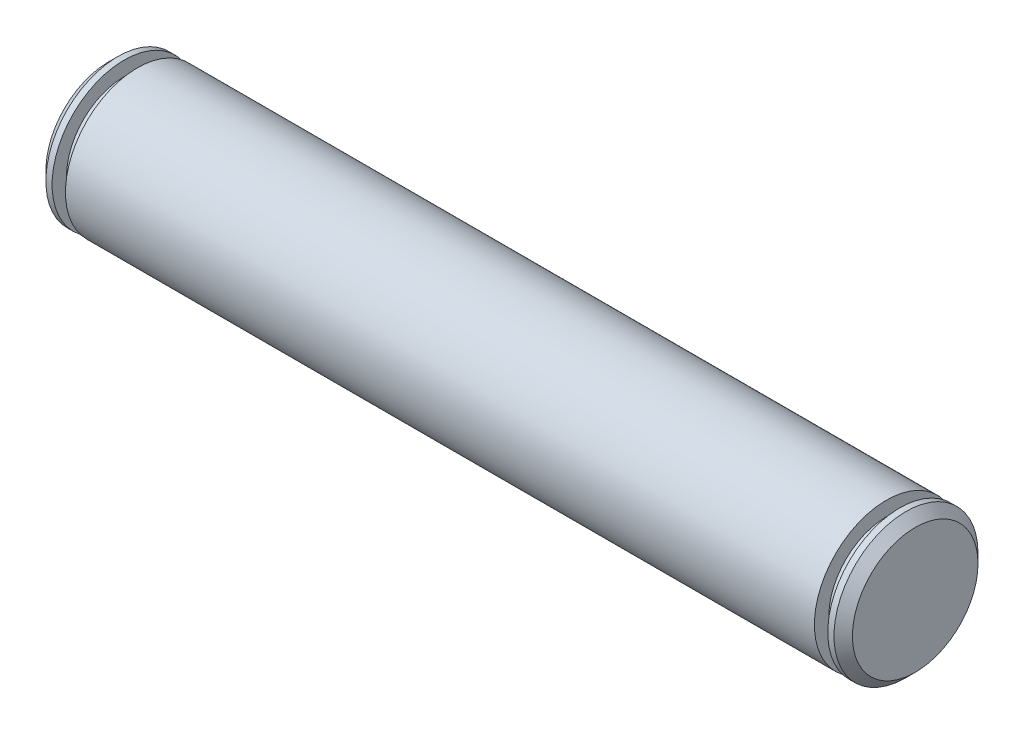
ISO-10303-21;
HEADER;
FILE_DESCRIPTION(('STEP AP214'),'2;1');
FILE_NAME('part.step','',(''),(''),'','','');
FILE_SCHEMA(('AUTOMOTIVE_DESIGN { 1 0 10303 214 1 1 1 1 }'));
ENDSEC;
DATA;
#1=APPLICATION_CONTEXT('core data for automotive mechanical design processes');
#2=APPLICATION_PROTOCOL_DEFINITION('international standard','automotive_design',2000,#1);
#3=PRODUCT_CONTEXT('',#1,'mechanical');
#4=PRODUCT('Part','Part','',(#3));
#5=PRODUCT_RELATED_PRODUCT_CATEGORY('part','',(#4));
#6=PRODUCT_DEFINITION_FORMATION('','',#4);
#7=PRODUCT_DEFINITION_CONTEXT('part definition',#1,'design');
#8=PRODUCT_DEFINITION('design','',#6,#7);
#9=PRODUCT_DEFINITION_SHAPE('','',#8);
#10=(LENGTH_UNIT() NAMED_UNIT(*) SI_UNIT(.MILLI.,.METRE.));
#11=(NAMED_UNIT(*) PLANE_ANGLE_UNIT() SI_UNIT($,.RADIAN.));
#12=(NAMED_UNIT(*) SI_UNIT($,.STERADIAN.) SOLID_ANGLE_UNIT());
#13=UNCERTAINTY_MEASURE_WITH_UNIT(LENGTH_MEASURE(1.E-05),#10,'distance_accuracy_value','');
#14=(GEOMETRIC_REPRESENTATION_CONTEXT(3) GLOBAL_UNCERTAINTY_ASSIGNED_CONTEXT((#13)) GLOBAL_UNIT_ASSIGNED_CONTEXT((#10,
#11,#12)) REPRESENTATION_CONTEXT('',''));
#15=CARTESIAN_POINT('',(0.,0.,0.));
#16=DIRECTION('',(0.,0.,1.));
#17=DIRECTION('',(1.,0.,0.));
#18=AXIS2_PLACEMENT_3D('',#15,#16,#17);
#19=CARTESIAN_POINT('',(22.225,0.,0.));
#20=DIRECTION('',(-1.,0.,0.));
#21=DIRECTION('',(0.,0.,1.));
#22=AXIS2_PLACEMENT_3D('',#19,#20,#21);
#23=CYLINDRICAL_SURFACE('',#22,3.96875);
#24=CARTESIAN_POINT('',(20.6375,0.,0.));
#25=DIRECTION('',(1.,0.,0.));
#26=DIRECTION('',(0.,0.,-1.));
#27=AXIS2_PLACEMENT_3D('',#24,#25,#26);
#28=CIRCLE('',#27,3.96875);
#29=CARTESIAN_POINT('',(20.6375,0.,-3.96875));
#30=VERTEX_POINT('',#29);
#31=EDGE_CURVE('E52',#30,#30,#28,.T.);
#32=ORIENTED_EDGE('',*,*,#31,.F.);
#33=EDGE_LOOP('',(#32));
#34=FACE_BOUND('',#33,.T.);
#35=CARTESIAN_POINT('',(-20.6375,0.,0.));
#36=DIRECTION('',(1.,0.,0.));
#37=DIRECTION('',(0.,0.,-1.));
#38=AXIS2_PLACEMENT_3D('',#35,#36,#37);
#39=CIRCLE('',#38,3.96875);
#40=CARTESIAN_POINT('',(-20.6375,0.,-3.96875));
#41=VERTEX_POINT('',#40);
#42=EDGE_CURVE('E64',#41,#41,#39,.T.);
#43=ORIENTED_EDGE('',*,*,#42,.T.);
#44=EDGE_LOOP('',(#43));
#45=FACE_BOUND('',#44,.T.);
#46=ADVANCED_FACE('F31',(#34,#45),#23,.T.);
#47=CARTESIAN_POINT('',(21.3741,0.,0.));
#48=DIRECTION('',(1.,0.,0.));
#49=DIRECTION('',(0.,0.,-1.));
#50=AXIS2_PLACEMENT_3D('',#47,#48,#49);
#51=CIRCLE('',#50,3.96875);
#52=CARTESIAN_POINT('',(21.3741,0.,-3.96875));
#53=VERTEX_POINT('',#52);
#54=EDGE_CURVE('E51',#53,#53,#51,.T.);
#55=ORIENTED_EDGE('',*,*,#54,.T.);
#56=EDGE_LOOP('',(#55));
#57=FACE_BOUND('',#56,.T.);
#58=CARTESIAN_POINT('',(21.717,0.,0.));
#59=DIRECTION('',(1.,0.,0.));
#60=DIRECTION('',(0.,0.,-1.));
#61=AXIS2_PLACEMENT_3D('',#58,#59,#60);
#62=CIRCLE('',#61,3.96875);
#63=CARTESIAN_POINT('',(21.717,0.,-3.96875));
#64=VERTEX_POINT('',#63);
#65=EDGE_CURVE('E46',#64,#64,#62,.F.);
#66=ORIENTED_EDGE('',*,*,#65,.T.);
#67=EDGE_LOOP('',(#66));
#68=FACE_BOUND('',#67,.T.);
#69=ADVANCED_FACE('F92',(#57,#68),#23,.T.);
#70=CARTESIAN_POINT('',(22.225,0.,0.));
#71=DIRECTION('',(1.,0.,0.));
#72=DIRECTION('',(0.,0.,-1.));
#73=AXIS2_PLACEMENT_3D('',#70,#71,#72);
#74=PLANE('',#73);
#75=CARTESIAN_POINT('',(22.225,0.,0.));
#76=DIRECTION('',(1.,0.,0.));
#77=DIRECTION('',(0.,0.,-1.));
#78=AXIS2_PLACEMENT_3D('',#75,#76,#77);
#79=CIRCLE('',#78,3.46075);
#80=CARTESIAN_POINT('',(22.225,0.,-3.46075));
#81=VERTEX_POINT('',#80);
#82=EDGE_CURVE('E10',#81,#81,#79,.T.);
#83=ORIENTED_EDGE('',*,*,#82,.T.);
#84=EDGE_LOOP('',(#83));
#85=FACE_BOUND('',#84,.T.);
#86=ADVANCED_FACE('F107',(#85),#74,.T.);
#87=CARTESIAN_POINT('',(22.225,0.,0.));
#88=DIRECTION('',(-1.,0.,0.));
#89=DIRECTION('',(0.,0.,1.));
#90=AXIS2_PLACEMENT_3D('',#87,#88,#89);
#91=CONICAL_SURFACE('',#90,3.46075,0.785398163397448);
#92=ORIENTED_EDGE('',*,*,#65,.F.);
#93=EDGE_LOOP('',(#92));
#94=FACE_BOUND('',#93,.T.);
#95=ORIENTED_EDGE('',*,*,#82,.F.);
#96=EDGE_LOOP('',(#95));
#97=FACE_BOUND('',#96,.T.);
#98=ADVANCED_FACE('F33',(#94,#97),#91,.T.);
#99=CARTESIAN_POINT('',(21.3741,0.,0.));
#100=DIRECTION('',(1.,0.,0.));
#101=DIRECTION('',(0.,0.,-1.));
#102=AXIS2_PLACEMENT_3D('',#99,#100,#101);
#103=PLANE('',#102);
#104=ORIENTED_EDGE('',*,*,#54,.F.);
#105=EDGE_LOOP('',(#104));
#106=FACE_BOUND('',#105,.T.);
#107=CARTESIAN_POINT('',(21.3741,0.,0.));
#108=DIRECTION('',(1.,0.,0.));
#109=DIRECTION('',(0.,0.,-1.));
#110=AXIS2_PLACEMENT_3D('',#107,#108,#109);
#111=CIRCLE('',#110,3.175);
#112=CARTESIAN_POINT('',(21.3741,0.,-3.175));
#113=VERTEX_POINT('',#112);
#114=EDGE_CURVE('E55',#113,#113,#111,.T.);
#115=ORIENTED_EDGE('',*,*,#114,.T.);
#116=EDGE_LOOP('',(#115));
#117=FACE_BOUND('',#116,.T.);
#118=ADVANCED_FACE('F117',(#106,#117),#103,.F.);
#119=CARTESIAN_POINT('',(20.6375,0.,0.));
#120=DIRECTION('',(1.,0.,0.));
#121=DIRECTION('',(0.,0.,-1.));
#122=AXIS2_PLACEMENT_3D('',#119,#120,#121);
#123=PLANE('',#122);
#124=ORIENTED_EDGE('',*,*,#31,.T.);
#125=EDGE_LOOP('',(#124));
#126=FACE_BOUND('',#125,.T.);
#127=CARTESIAN_POINT('',(20.6375,0.,0.));
#128=DIRECTION('',(1.,0.,0.));
#129=DIRECTION('',(0.,0.,-1.));
#130=AXIS2_PLACEMENT_3D('',#127,#128,#129);
#131=CIRCLE('',#130,3.175);
#132=CARTESIAN_POINT('',(20.6375,0.,-3.175));
#133=VERTEX_POINT('',#132);
#134=EDGE_CURVE('E58',#133,#133,#131,.T.);
#135=ORIENTED_EDGE('',*,*,#134,.F.);
#136=EDGE_LOOP('',(#135));
#137=FACE_BOUND('',#136,.T.);
#138=ADVANCED_FACE('F114',(#126,#137),#123,.T.);
#139=CARTESIAN_POINT('',(21.3741,0.,0.));
#140=DIRECTION('',(-1.,0.,0.));
#141=DIRECTION('',(0.,0.,1.));
#142=AXIS2_PLACEMENT_3D('',#139,#140,#141);
#143=CYLINDRICAL_SURFACE('',#142,3.175);
#144=ORIENTED_EDGE('',*,*,#114,.F.);
#145=EDGE_LOOP('',(#144));
#146=FACE_BOUND('',#145,.T.);
#147=ORIENTED_EDGE('',*,*,#134,.T.);
#148=EDGE_LOOP('',(#147));
#149=FACE_BOUND('',#148,.T.);
#150=ADVANCED_FACE('F83',(#146,#149),#143,.T.);
#151=CARTESIAN_POINT('',(-21.3741,0.,0.));
#152=DIRECTION('',(-1.,0.,0.));
#153=DIRECTION('',(0.,0.,-1.));
#154=AXIS2_PLACEMENT_3D('',#151,#152,#153);
#155=PLANE('',#154);
#156=CARTESIAN_POINT('',(-21.3741,0.,0.));
#157=DIRECTION('',(1.,0.,0.));
#158=DIRECTION('',(0.,0.,-1.));
#159=AXIS2_PLACEMENT_3D('',#156,#157,#158);
#160=CIRCLE('',#159,3.175);
#161=CARTESIAN_POINT('',(-21.3741,0.,-3.175));
#162=VERTEX_POINT('',#161);
#163=EDGE_CURVE('E67',#162,#162,#160,.T.);
#164=ORIENTED_EDGE('',*,*,#163,.F.);
#165=EDGE_LOOP('',(#164));
#166=FACE_BOUND('',#165,.T.);
#167=CARTESIAN_POINT('',(-21.3741,0.,0.));
#168=DIRECTION('',(1.,0.,0.));
#169=DIRECTION('',(0.,0.,-1.));
#170=AXIS2_PLACEMENT_3D('',#167,#168,#169);
#171=CIRCLE('',#170,3.96875);
#172=CARTESIAN_POINT('',(-21.3741,0.,-3.96875));
#173=VERTEX_POINT('',#172);
#174=EDGE_CURVE('E61',#173,#173,#171,.T.);
#175=ORIENTED_EDGE('',*,*,#174,.T.);
#176=EDGE_LOOP('',(#175));
#177=FACE_BOUND('',#176,.T.);
#178=ADVANCED_FACE('F79',(#166,#177),#155,.F.);
#179=CARTESIAN_POINT('',(-20.6375,0.,0.));
#180=DIRECTION('',(-1.,0.,0.));
#181=DIRECTION('',(0.,0.,-1.));
#182=AXIS2_PLACEMENT_3D('',#179,#180,#181);
#183=PLANE('',#182);
#184=CARTESIAN_POINT('',(-20.6375,0.,0.));
#185=DIRECTION('',(1.,0.,0.));
#186=DIRECTION('',(0.,0.,-1.));
#187=AXIS2_PLACEMENT_3D('',#184,#185,#186);
#188=CIRCLE('',#187,3.175);
#189=CARTESIAN_POINT('',(-20.6375,0.,-3.175));
#190=VERTEX_POINT('',#189);
#191=EDGE_CURVE('E70',#190,#190,#188,.T.);
#192=ORIENTED_EDGE('',*,*,#191,.T.);
#193=EDGE_LOOP('',(#192));
#194=FACE_BOUND('',#193,.T.);
#195=ORIENTED_EDGE('',*,*,#42,.F.);
#196=EDGE_LOOP('',(#195));
#197=FACE_BOUND('',#196,.T.);
#198=ADVANCED_FACE('F82',(#194,#197),#183,.T.);
#199=CARTESIAN_POINT('',(-21.3741,0.,0.));
#200=DIRECTION('',(1.,0.,0.));
#201=DIRECTION('',(0.,0.,-1.));
#202=AXIS2_PLACEMENT_3D('',#199,#200,#201);
#203=CYLINDRICAL_SURFACE('',#202,3.175);
#204=ORIENTED_EDGE('',*,*,#163,.T.);
#205=EDGE_LOOP('',(#204));
#206=FACE_BOUND('',#205,.T.);
#207=ORIENTED_EDGE('',*,*,#191,.F.);
#208=EDGE_LOOP('',(#207));
#209=FACE_BOUND('',#208,.T.);
#210=ADVANCED_FACE('F76',(#206,#209),#203,.T.);
#211=CARTESIAN_POINT('',(-22.225,0.,0.));
#212=DIRECTION('',(1.,0.,0.));
#213=DIRECTION('',(0.,0.,-1.));
#214=AXIS2_PLACEMENT_3D('',#211,#212,#213);
#215=PLANE('',#214);
#216=CARTESIAN_POINT('',(-22.225,0.,0.));
#217=DIRECTION('',(1.,0.,0.));
#218=DIRECTION('',(0.,0.,-1.));
#219=AXIS2_PLACEMENT_3D('',#216,#217,#218);
#220=CIRCLE('',#219,3.46074999999999);
#221=CARTESIAN_POINT('',(-22.225,0.,-3.46074999999999));
#222=VERTEX_POINT('',#221);
#223=EDGE_CURVE('E38',#222,#222,#220,.F.);
#224=ORIENTED_EDGE('',*,*,#223,.T.);
#225=EDGE_LOOP('',(#224));
#226=FACE_BOUND('',#225,.T.);
#227=ADVANCED_FACE('F96',(#226),#215,.F.);
#228=CARTESIAN_POINT('',(-21.717,0.,0.));
#229=DIRECTION('',(1.,0.,0.));
#230=DIRECTION('',(0.,0.,-1.));
#231=AXIS2_PLACEMENT_3D('',#228,#229,#230);
#232=CONICAL_SURFACE('',#231,3.96875,0.785398163397448);
#233=ORIENTED_EDGE('',*,*,#223,.F.);
#234=EDGE_LOOP('',(#233));
#235=FACE_BOUND('',#234,.T.);
#236=CARTESIAN_POINT('',(-21.717,0.,0.));
#237=DIRECTION('',(1.,0.,0.));
#238=DIRECTION('',(0.,0.,-1.));
#239=AXIS2_PLACEMENT_3D('',#236,#237,#238);
#240=CIRCLE('',#239,3.96875);
#241=CARTESIAN_POINT('',(-21.717,0.,-3.96875));
#242=VERTEX_POINT('',#241);
#243=EDGE_CURVE('E42',#242,#242,#240,.T.);
#244=ORIENTED_EDGE('',*,*,#243,.F.);
#245=EDGE_LOOP('',(#244));
#246=FACE_BOUND('',#245,.T.);
#247=ADVANCED_FACE('F90',(#235,#246),#232,.T.);
#248=ORIENTED_EDGE('',*,*,#174,.F.);
#249=EDGE_LOOP('',(#248));
#250=FACE_BOUND('',#249,.T.);
#251=ORIENTED_EDGE('',*,*,#243,.T.);
#252=EDGE_LOOP('',(#251));
#253=FACE_BOUND('',#252,.T.);
#254=ADVANCED_FACE('F87',(#250,#253),#23,.T.);
#255=CLOSED_SHELL('',(#46,#69,#86,#98,#118,#138,#150,#178,#198,#210,#227,#247,#254));
#256=MANIFOLD_SOLID_BREP('B2',#255);
#257=ADVANCED_BREP_SHAPE_REPRESENTATION('',(#18,#256),#14);
#258=SHAPE_DEFINITION_REPRESENTATION(#9,#257);
ENDSEC;
END-ISO-10303-21;
